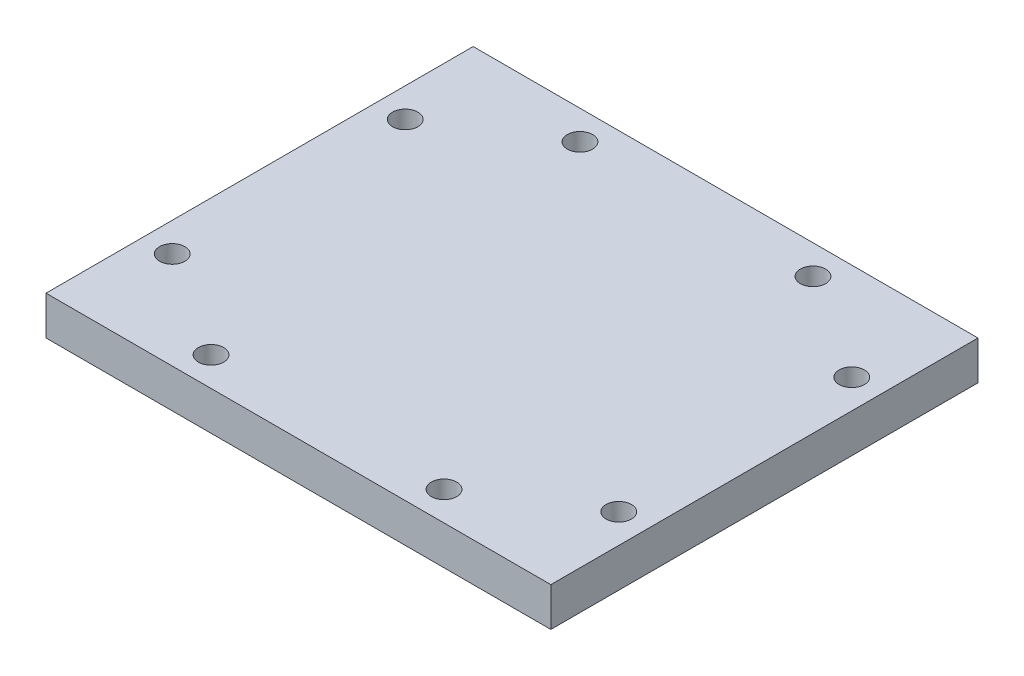
ISO-10303-21;
HEADER;
FILE_DESCRIPTION(('STEP AP214'),'2;1');
FILE_NAME('part.step','',(''),(''),'','','');
FILE_SCHEMA(('AUTOMOTIVE_DESIGN { 1 0 10303 214 1 1 1 1 }'));
ENDSEC;
DATA;
#1=APPLICATION_CONTEXT('core data for automotive mechanical design processes');
#2=APPLICATION_PROTOCOL_DEFINITION('international standard','automotive_design',2000,#1);
#3=PRODUCT_CONTEXT('',#1,'mechanical');
#4=PRODUCT('Part','Part','',(#3));
#5=PRODUCT_RELATED_PRODUCT_CATEGORY('part','',(#4));
#6=PRODUCT_DEFINITION_FORMATION('','',#4);
#7=PRODUCT_DEFINITION_CONTEXT('part definition',#1,'design');
#8=PRODUCT_DEFINITION('design','',#6,#7);
#9=PRODUCT_DEFINITION_SHAPE('','',#8);
#10=(LENGTH_UNIT() NAMED_UNIT(*) SI_UNIT(.MILLI.,.METRE.));
#11=(NAMED_UNIT(*) PLANE_ANGLE_UNIT() SI_UNIT($,.RADIAN.));
#12=(NAMED_UNIT(*) SI_UNIT($,.STERADIAN.) SOLID_ANGLE_UNIT());
#13=UNCERTAINTY_MEASURE_WITH_UNIT(LENGTH_MEASURE(1.E-05),#10,'distance_accuracy_value','');
#14=(GEOMETRIC_REPRESENTATION_CONTEXT(3) GLOBAL_UNCERTAINTY_ASSIGNED_CONTEXT((#13)) GLOBAL_UNIT_ASSIGNED_CONTEXT((#10,
#11,#12)) REPRESENTATION_CONTEXT('',''));
#15=CARTESIAN_POINT('',(0.,0.,0.));
#16=DIRECTION('',(0.,0.,1.));
#17=DIRECTION('',(1.,0.,0.));
#18=AXIS2_PLACEMENT_3D('',#15,#16,#17);
#19=CARTESIAN_POINT('',(0.,0.,0.));
#20=DIRECTION('',(0.,1.,0.));
#21=DIRECTION('',(0.,0.,1.));
#22=AXIS2_PLACEMENT_3D('',#19,#20,#21);
#23=PLANE('',#22);
#24=DIRECTION('',(0.,0.,1.));
#25=VECTOR('',#24,1.);
#26=CARTESIAN_POINT('',(-32.5,0.,27.5));
#27=LINE('',#26,#25);
#28=CARTESIAN_POINT('',(-32.5,0.,-27.5));
#29=VERTEX_POINT('',#28);
#30=CARTESIAN_POINT('',(-32.5,0.,27.5));
#31=VERTEX_POINT('',#30);
#32=EDGE_CURVE('E97',#29,#31,#27,.T.);
#33=ORIENTED_EDGE('',*,*,#32,.F.);
#34=DIRECTION('',(-1.,0.,0.));
#35=VECTOR('',#34,1.);
#36=CARTESIAN_POINT('',(32.5,0.,-27.5));
#37=LINE('',#36,#35);
#38=CARTESIAN_POINT('',(32.5,0.,-27.5));
#39=VERTEX_POINT('',#38);
#40=EDGE_CURVE('E73',#39,#29,#37,.T.);
#41=ORIENTED_EDGE('',*,*,#40,.F.);
#42=DIRECTION('',(0.,0.,-1.));
#43=VECTOR('',#42,1.);
#44=CARTESIAN_POINT('',(32.5,0.,27.5));
#45=LINE('',#44,#43);
#46=CARTESIAN_POINT('',(32.5,0.,27.5));
#47=VERTEX_POINT('',#46);
#48=EDGE_CURVE('E67',#47,#39,#45,.T.);
#49=ORIENTED_EDGE('',*,*,#48,.F.);
#50=DIRECTION('',(1.,0.,0.));
#51=VECTOR('',#50,1.);
#52=CARTESIAN_POINT('',(32.5,0.,27.5));
#53=LINE('',#52,#51);
#54=EDGE_CURVE('E89',#31,#47,#53,.T.);
#55=ORIENTED_EDGE('',*,*,#54,.F.);
#56=EDGE_LOOP('',(#33,#41,#49,#55));
#57=FACE_BOUND('',#56,.T.);
#58=CARTESIAN_POINT('',(28.75,0.,15.));
#59=DIRECTION('',(0.,-1.,0.));
#60=DIRECTION('',(0.,0.,-1.));
#61=AXIS2_PLACEMENT_3D('',#58,#59,#60);
#62=CIRCLE('',#61,1.63195);
#63=CARTESIAN_POINT('',(28.75,0.,13.36805));
#64=VERTEX_POINT('',#63);
#65=EDGE_CURVE('E113',#64,#64,#62,.T.);
#66=ORIENTED_EDGE('',*,*,#65,.F.);
#67=EDGE_LOOP('',(#66));
#68=FACE_BOUND('',#67,.T.);
#69=CARTESIAN_POINT('',(15.,0.,23.75));
#70=DIRECTION('',(0.,-1.,0.));
#71=DIRECTION('',(0.,0.,-1.));
#72=AXIS2_PLACEMENT_3D('',#69,#70,#71);
#73=CIRCLE('',#72,1.63195);
#74=CARTESIAN_POINT('',(15.,0.,22.11805));
#75=VERTEX_POINT('',#74);
#76=EDGE_CURVE('E119',#75,#75,#73,.T.);
#77=ORIENTED_EDGE('',*,*,#76,.F.);
#78=EDGE_LOOP('',(#77));
#79=FACE_BOUND('',#78,.T.);
#80=CARTESIAN_POINT('',(-15.,0.,23.75));
#81=DIRECTION('',(0.,-1.,0.));
#82=DIRECTION('',(0.,0.,-1.));
#83=AXIS2_PLACEMENT_3D('',#80,#81,#82);
#84=CIRCLE('',#83,1.63195);
#85=CARTESIAN_POINT('',(-15.,0.,22.11805));
#86=VERTEX_POINT('',#85);
#87=EDGE_CURVE('E125',#86,#86,#84,.T.);
#88=ORIENTED_EDGE('',*,*,#87,.F.);
#89=EDGE_LOOP('',(#88));
#90=FACE_BOUND('',#89,.T.);
#91=CARTESIAN_POINT('',(-28.75,0.,15.));
#92=DIRECTION('',(0.,-1.,0.));
#93=DIRECTION('',(0.,0.,-1.));
#94=AXIS2_PLACEMENT_3D('',#91,#92,#93);
#95=CIRCLE('',#94,1.63195);
#96=CARTESIAN_POINT('',(-28.75,0.,13.36805));
#97=VERTEX_POINT('',#96);
#98=EDGE_CURVE('E131',#97,#97,#95,.T.);
#99=ORIENTED_EDGE('',*,*,#98,.F.);
#100=EDGE_LOOP('',(#99));
#101=FACE_BOUND('',#100,.T.);
#102=CARTESIAN_POINT('',(-28.75,0.,-15.));
#103=DIRECTION('',(0.,-1.,0.));
#104=DIRECTION('',(0.,0.,-1.));
#105=AXIS2_PLACEMENT_3D('',#102,#103,#104);
#106=CIRCLE('',#105,1.63195);
#107=CARTESIAN_POINT('',(-28.75,0.,-16.63195));
#108=VERTEX_POINT('',#107);
#109=EDGE_CURVE('E137',#108,#108,#106,.T.);
#110=ORIENTED_EDGE('',*,*,#109,.F.);
#111=EDGE_LOOP('',(#110));
#112=FACE_BOUND('',#111,.T.);
#113=CARTESIAN_POINT('',(-15.,0.,-23.75));
#114=DIRECTION('',(0.,-1.,0.));
#115=DIRECTION('',(0.,0.,-1.));
#116=AXIS2_PLACEMENT_3D('',#113,#114,#115);
#117=CIRCLE('',#116,1.63195);
#118=CARTESIAN_POINT('',(-15.,0.,-25.38195));
#119=VERTEX_POINT('',#118);
#120=EDGE_CURVE('E143',#119,#119,#117,.T.);
#121=ORIENTED_EDGE('',*,*,#120,.F.);
#122=EDGE_LOOP('',(#121));
#123=FACE_BOUND('',#122,.T.);
#124=CARTESIAN_POINT('',(15.,0.,-23.75));
#125=DIRECTION('',(0.,-1.,0.));
#126=DIRECTION('',(0.,0.,-1.));
#127=AXIS2_PLACEMENT_3D('',#124,#125,#126);
#128=CIRCLE('',#127,1.63195);
#129=CARTESIAN_POINT('',(15.,0.,-25.38195));
#130=VERTEX_POINT('',#129);
#131=EDGE_CURVE('E149',#130,#130,#128,.T.);
#132=ORIENTED_EDGE('',*,*,#131,.F.);
#133=EDGE_LOOP('',(#132));
#134=FACE_BOUND('',#133,.T.);
#135=CARTESIAN_POINT('',(28.75,0.,-15.));
#136=DIRECTION('',(0.,-1.,0.));
#137=DIRECTION('',(0.,0.,-1.));
#138=AXIS2_PLACEMENT_3D('',#135,#136,#137);
#139=CIRCLE('',#138,1.63195);
#140=CARTESIAN_POINT('',(28.75,0.,-16.63195));
#141=VERTEX_POINT('',#140);
#142=EDGE_CURVE('E155',#141,#141,#139,.T.);
#143=ORIENTED_EDGE('',*,*,#142,.F.);
#144=EDGE_LOOP('',(#143));
#145=FACE_BOUND('',#144,.T.);
#146=ADVANCED_FACE('F33',(#57,#68,#79,#90,#101,#112,#123,#134,#145),#23,.F.);
#147=CARTESIAN_POINT('',(-32.5,5.,27.5));
#148=DIRECTION('',(1.,0.,0.));
#149=DIRECTION('',(0.,0.,-1.));
#150=AXIS2_PLACEMENT_3D('',#147,#148,#149);
#151=PLANE('',#150);
#152=ORIENTED_EDGE('',*,*,#32,.T.);
#153=DIRECTION('',(0.,-1.,0.));
#154=VECTOR('',#153,1.);
#155=CARTESIAN_POINT('',(-32.5,5.,27.5));
#156=LINE('',#155,#154);
#157=CARTESIAN_POINT('',(-32.5,5.,27.5));
#158=VERTEX_POINT('',#157);
#159=EDGE_CURVE('E11',#158,#31,#156,.T.);
#160=ORIENTED_EDGE('',*,*,#159,.F.);
#161=DIRECTION('',(0.,0.,1.));
#162=VECTOR('',#161,1.);
#163=CARTESIAN_POINT('',(-32.5,5.,27.5));
#164=LINE('',#163,#162);
#165=CARTESIAN_POINT('',(-32.5,5.,-27.5));
#166=VERTEX_POINT('',#165);
#167=EDGE_CURVE('E85',#166,#158,#164,.T.);
#168=ORIENTED_EDGE('',*,*,#167,.F.);
#169=DIRECTION('',(0.,-1.,0.));
#170=VECTOR('',#169,1.);
#171=CARTESIAN_POINT('',(-32.5,5.,-27.5));
#172=LINE('',#171,#170);
#173=EDGE_CURVE('E93',#166,#29,#172,.T.);
#174=ORIENTED_EDGE('',*,*,#173,.T.);
#175=EDGE_LOOP('',(#152,#160,#168,#174));
#176=FACE_BOUND('',#175,.T.);
#177=ADVANCED_FACE('F35',(#176),#151,.F.);
#178=CARTESIAN_POINT('',(32.5,5.,27.5));
#179=DIRECTION('',(0.,0.,-1.));
#180=DIRECTION('',(-1.,0.,0.));
#181=AXIS2_PLACEMENT_3D('',#178,#179,#180);
#182=PLANE('',#181);
#183=ORIENTED_EDGE('',*,*,#54,.T.);
#184=DIRECTION('',(0.,-1.,0.));
#185=VECTOR('',#184,1.);
#186=CARTESIAN_POINT('',(32.5,5.,27.5));
#187=LINE('',#186,#185);
#188=CARTESIAN_POINT('',(32.5,5.,27.5));
#189=VERTEX_POINT('',#188);
#190=EDGE_CURVE('E42',#189,#47,#187,.T.);
#191=ORIENTED_EDGE('',*,*,#190,.F.);
#192=DIRECTION('',(1.,0.,0.));
#193=VECTOR('',#192,1.);
#194=CARTESIAN_POINT('',(32.5,5.,27.5));
#195=LINE('',#194,#193);
#196=EDGE_CURVE('E80',#158,#189,#195,.T.);
#197=ORIENTED_EDGE('',*,*,#196,.F.);
#198=ORIENTED_EDGE('',*,*,#159,.T.);
#199=EDGE_LOOP('',(#183,#191,#197,#198));
#200=FACE_BOUND('',#199,.T.);
#201=ADVANCED_FACE('F88',(#200),#182,.F.);
#202=CARTESIAN_POINT('',(32.5,5.,27.5));
#203=DIRECTION('',(-1.,0.,0.));
#204=DIRECTION('',(0.,0.,1.));
#205=AXIS2_PLACEMENT_3D('',#202,#203,#204);
#206=PLANE('',#205);
#207=ORIENTED_EDGE('',*,*,#48,.T.);
#208=DIRECTION('',(0.,-1.,0.));
#209=VECTOR('',#208,1.);
#210=CARTESIAN_POINT('',(32.5,5.,-27.5));
#211=LINE('',#210,#209);
#212=CARTESIAN_POINT('',(32.5,5.,-27.5));
#213=VERTEX_POINT('',#212);
#214=EDGE_CURVE('E90',#213,#39,#211,.T.);
#215=ORIENTED_EDGE('',*,*,#214,.F.);
#216=DIRECTION('',(0.,0.,-1.));
#217=VECTOR('',#216,1.);
#218=CARTESIAN_POINT('',(32.5,5.,27.5));
#219=LINE('',#218,#217);
#220=EDGE_CURVE('E83',#189,#213,#219,.T.);
#221=ORIENTED_EDGE('',*,*,#220,.F.);
#222=ORIENTED_EDGE('',*,*,#190,.T.);
#223=EDGE_LOOP('',(#207,#215,#221,#222));
#224=FACE_BOUND('',#223,.T.);
#225=ADVANCED_FACE('F91',(#224),#206,.F.);
#226=CARTESIAN_POINT('',(32.5,5.,-27.5));
#227=DIRECTION('',(0.,0.,1.));
#228=DIRECTION('',(1.,0.,0.));
#229=AXIS2_PLACEMENT_3D('',#226,#227,#228);
#230=PLANE('',#229);
#231=ORIENTED_EDGE('',*,*,#40,.T.);
#232=ORIENTED_EDGE('',*,*,#173,.F.);
#233=DIRECTION('',(-1.,0.,0.));
#234=VECTOR('',#233,1.);
#235=CARTESIAN_POINT('',(32.5,5.,-27.5));
#236=LINE('',#235,#234);
#237=EDGE_CURVE('E50',#213,#166,#236,.T.);
#238=ORIENTED_EDGE('',*,*,#237,.F.);
#239=ORIENTED_EDGE('',*,*,#214,.T.);
#240=EDGE_LOOP('',(#231,#232,#238,#239));
#241=FACE_BOUND('',#240,.T.);
#242=ADVANCED_FACE('F105',(#241),#230,.F.);
#243=CARTESIAN_POINT('',(0.,5.,0.));
#244=DIRECTION('',(0.,1.,0.));
#245=DIRECTION('',(0.,0.,1.));
#246=AXIS2_PLACEMENT_3D('',#243,#244,#245);
#247=PLANE('',#246);
#248=CARTESIAN_POINT('',(28.75,5.,-15.));
#249=DIRECTION('',(0.,1.,0.));
#250=DIRECTION('',(0.,0.,1.));
#251=AXIS2_PLACEMENT_3D('',#248,#249,#250);
#252=CIRCLE('',#251,1.63195);
#253=CARTESIAN_POINT('',(28.75,5.,-13.36805));
#254=VERTEX_POINT('',#253);
#255=EDGE_CURVE('E152',#254,#254,#252,.T.);
#256=ORIENTED_EDGE('',*,*,#255,.F.);
#257=EDGE_LOOP('',(#256));
#258=FACE_BOUND('',#257,.T.);
#259=CARTESIAN_POINT('',(15.,5.,-23.75));
#260=DIRECTION('',(0.,1.,0.));
#261=DIRECTION('',(0.,0.,1.));
#262=AXIS2_PLACEMENT_3D('',#259,#260,#261);
#263=CIRCLE('',#262,1.63195);
#264=CARTESIAN_POINT('',(15.,5.,-22.11805));
#265=VERTEX_POINT('',#264);
#266=EDGE_CURVE('E146',#265,#265,#263,.T.);
#267=ORIENTED_EDGE('',*,*,#266,.F.);
#268=EDGE_LOOP('',(#267));
#269=FACE_BOUND('',#268,.T.);
#270=CARTESIAN_POINT('',(-15.,5.,-23.75));
#271=DIRECTION('',(0.,1.,0.));
#272=DIRECTION('',(0.,0.,1.));
#273=AXIS2_PLACEMENT_3D('',#270,#271,#272);
#274=CIRCLE('',#273,1.63195);
#275=CARTESIAN_POINT('',(-15.,5.,-22.11805));
#276=VERTEX_POINT('',#275);
#277=EDGE_CURVE('E140',#276,#276,#274,.T.);
#278=ORIENTED_EDGE('',*,*,#277,.F.);
#279=EDGE_LOOP('',(#278));
#280=FACE_BOUND('',#279,.T.);
#281=CARTESIAN_POINT('',(-28.75,5.,-15.));
#282=DIRECTION('',(0.,1.,0.));
#283=DIRECTION('',(0.,0.,1.));
#284=AXIS2_PLACEMENT_3D('',#281,#282,#283);
#285=CIRCLE('',#284,1.63195);
#286=CARTESIAN_POINT('',(-28.75,5.,-13.36805));
#287=VERTEX_POINT('',#286);
#288=EDGE_CURVE('E134',#287,#287,#285,.T.);
#289=ORIENTED_EDGE('',*,*,#288,.F.);
#290=EDGE_LOOP('',(#289));
#291=FACE_BOUND('',#290,.T.);
#292=CARTESIAN_POINT('',(-28.75,5.,15.));
#293=DIRECTION('',(0.,1.,0.));
#294=DIRECTION('',(0.,0.,1.));
#295=AXIS2_PLACEMENT_3D('',#292,#293,#294);
#296=CIRCLE('',#295,1.63195);
#297=CARTESIAN_POINT('',(-28.75,5.,16.63195));
#298=VERTEX_POINT('',#297);
#299=EDGE_CURVE('E128',#298,#298,#296,.T.);
#300=ORIENTED_EDGE('',*,*,#299,.F.);
#301=EDGE_LOOP('',(#300));
#302=FACE_BOUND('',#301,.T.);
#303=CARTESIAN_POINT('',(-15.,5.,23.75));
#304=DIRECTION('',(0.,1.,0.));
#305=DIRECTION('',(0.,0.,1.));
#306=AXIS2_PLACEMENT_3D('',#303,#304,#305);
#307=CIRCLE('',#306,1.63195);
#308=CARTESIAN_POINT('',(-15.,5.,25.38195));
#309=VERTEX_POINT('',#308);
#310=EDGE_CURVE('E122',#309,#309,#307,.T.);
#311=ORIENTED_EDGE('',*,*,#310,.F.);
#312=EDGE_LOOP('',(#311));
#313=FACE_BOUND('',#312,.T.);
#314=CARTESIAN_POINT('',(15.,5.,23.75));
#315=DIRECTION('',(0.,1.,0.));
#316=DIRECTION('',(0.,0.,1.));
#317=AXIS2_PLACEMENT_3D('',#314,#315,#316);
#318=CIRCLE('',#317,1.63195);
#319=CARTESIAN_POINT('',(15.,5.,25.38195));
#320=VERTEX_POINT('',#319);
#321=EDGE_CURVE('E116',#320,#320,#318,.T.);
#322=ORIENTED_EDGE('',*,*,#321,.F.);
#323=EDGE_LOOP('',(#322));
#324=FACE_BOUND('',#323,.T.);
#325=CARTESIAN_POINT('',(28.75,5.,15.));
#326=DIRECTION('',(0.,1.,0.));
#327=DIRECTION('',(0.,0.,1.));
#328=AXIS2_PLACEMENT_3D('',#325,#326,#327);
#329=CIRCLE('',#328,1.63195);
#330=CARTESIAN_POINT('',(28.75,5.,16.63195));
#331=VERTEX_POINT('',#330);
#332=EDGE_CURVE('E100',#331,#331,#329,.T.);
#333=ORIENTED_EDGE('',*,*,#332,.F.);
#334=EDGE_LOOP('',(#333));
#335=FACE_BOUND('',#334,.T.);
#336=ORIENTED_EDGE('',*,*,#167,.T.);
#337=ORIENTED_EDGE('',*,*,#196,.T.);
#338=ORIENTED_EDGE('',*,*,#220,.T.);
#339=ORIENTED_EDGE('',*,*,#237,.T.);
#340=EDGE_LOOP('',(#336,#337,#338,#339));
#341=FACE_BOUND('',#340,.T.);
#342=ADVANCED_FACE('F81',(#258,#269,#280,#291,#302,#313,#324,#335,#341),#247,.T.);
#343=CARTESIAN_POINT('',(28.75,0.,15.));
#344=DIRECTION('',(0.,-1.,0.));
#345=DIRECTION('',(0.,0.,-1.));
#346=AXIS2_PLACEMENT_3D('',#343,#344,#345);
#347=CYLINDRICAL_SURFACE('',#346,1.63195);
#348=ORIENTED_EDGE('',*,*,#65,.T.);
#349=EDGE_LOOP('',(#348));
#350=FACE_BOUND('',#349,.T.);
#351=ORIENTED_EDGE('',*,*,#332,.T.);
#352=EDGE_LOOP('',(#351));
#353=FACE_BOUND('',#352,.T.);
#354=ADVANCED_FACE('F192',(#350,#353),#347,.F.);
#355=CARTESIAN_POINT('',(15.,0.,23.75));
#356=DIRECTION('',(0.,-1.,0.));
#357=DIRECTION('',(0.,0.,-1.));
#358=AXIS2_PLACEMENT_3D('',#355,#356,#357);
#359=CYLINDRICAL_SURFACE('',#358,1.63195);
#360=ORIENTED_EDGE('',*,*,#76,.T.);
#361=EDGE_LOOP('',(#360));
#362=FACE_BOUND('',#361,.T.);
#363=ORIENTED_EDGE('',*,*,#321,.T.);
#364=EDGE_LOOP('',(#363));
#365=FACE_BOUND('',#364,.T.);
#366=ADVANCED_FACE('F199',(#362,#365),#359,.F.);
#367=CARTESIAN_POINT('',(-15.,0.,23.75));
#368=DIRECTION('',(0.,-1.,0.));
#369=DIRECTION('',(0.,0.,-1.));
#370=AXIS2_PLACEMENT_3D('',#367,#368,#369);
#371=CYLINDRICAL_SURFACE('',#370,1.63195);
#372=ORIENTED_EDGE('',*,*,#87,.T.);
#373=EDGE_LOOP('',(#372));
#374=FACE_BOUND('',#373,.T.);
#375=ORIENTED_EDGE('',*,*,#310,.T.);
#376=EDGE_LOOP('',(#375));
#377=FACE_BOUND('',#376,.T.);
#378=ADVANCED_FACE('F206',(#374,#377),#371,.F.);
#379=CARTESIAN_POINT('',(-28.75,0.,15.));
#380=DIRECTION('',(0.,-1.,0.));
#381=DIRECTION('',(0.,0.,-1.));
#382=AXIS2_PLACEMENT_3D('',#379,#380,#381);
#383=CYLINDRICAL_SURFACE('',#382,1.63195);
#384=ORIENTED_EDGE('',*,*,#98,.T.);
#385=EDGE_LOOP('',(#384));
#386=FACE_BOUND('',#385,.T.);
#387=ORIENTED_EDGE('',*,*,#299,.T.);
#388=EDGE_LOOP('',(#387));
#389=FACE_BOUND('',#388,.T.);
#390=ADVANCED_FACE('F214',(#386,#389),#383,.F.);
#391=CARTESIAN_POINT('',(-28.75,0.,-15.));
#392=DIRECTION('',(0.,-1.,0.));
#393=DIRECTION('',(0.,0.,-1.));
#394=AXIS2_PLACEMENT_3D('',#391,#392,#393);
#395=CYLINDRICAL_SURFACE('',#394,1.63195);
#396=ORIENTED_EDGE('',*,*,#109,.T.);
#397=EDGE_LOOP('',(#396));
#398=FACE_BOUND('',#397,.T.);
#399=ORIENTED_EDGE('',*,*,#288,.T.);
#400=EDGE_LOOP('',(#399));
#401=FACE_BOUND('',#400,.T.);
#402=ADVANCED_FACE('F222',(#398,#401),#395,.F.);
#403=CARTESIAN_POINT('',(-15.,0.,-23.75));
#404=DIRECTION('',(0.,-1.,0.));
#405=DIRECTION('',(0.,0.,-1.));
#406=AXIS2_PLACEMENT_3D('',#403,#404,#405);
#407=CYLINDRICAL_SURFACE('',#406,1.63195);
#408=ORIENTED_EDGE('',*,*,#120,.T.);
#409=EDGE_LOOP('',(#408));
#410=FACE_BOUND('',#409,.T.);
#411=ORIENTED_EDGE('',*,*,#277,.T.);
#412=EDGE_LOOP('',(#411));
#413=FACE_BOUND('',#412,.T.);
#414=ADVANCED_FACE('F230',(#410,#413),#407,.F.);
#415=CARTESIAN_POINT('',(15.,0.,-23.75));
#416=DIRECTION('',(0.,-1.,0.));
#417=DIRECTION('',(0.,0.,-1.));
#418=AXIS2_PLACEMENT_3D('',#415,#416,#417);
#419=CYLINDRICAL_SURFACE('',#418,1.63195);
#420=ORIENTED_EDGE('',*,*,#131,.T.);
#421=EDGE_LOOP('',(#420));
#422=FACE_BOUND('',#421,.T.);
#423=ORIENTED_EDGE('',*,*,#266,.T.);
#424=EDGE_LOOP('',(#423));
#425=FACE_BOUND('',#424,.T.);
#426=ADVANCED_FACE('F238',(#422,#425),#419,.F.);
#427=CARTESIAN_POINT('',(28.75,0.,-15.));
#428=DIRECTION('',(0.,-1.,0.));
#429=DIRECTION('',(0.,0.,-1.));
#430=AXIS2_PLACEMENT_3D('',#427,#428,#429);
#431=CYLINDRICAL_SURFACE('',#430,1.63195);
#432=ORIENTED_EDGE('',*,*,#142,.T.);
#433=EDGE_LOOP('',(#432));
#434=FACE_BOUND('',#433,.T.);
#435=ORIENTED_EDGE('',*,*,#255,.T.);
#436=EDGE_LOOP('',(#435));
#437=FACE_BOUND('',#436,.T.);
#438=ADVANCED_FACE('F159',(#434,#437),#431,.F.);
#439=CLOSED_SHELL('',(#146,#177,#201,#225,#242,#342,#354,#366,#378,#390,#402,#414,#426,#438));
#440=MANIFOLD_SOLID_BREP('B2',#439);
#441=ADVANCED_BREP_SHAPE_REPRESENTATION('',(#18,#440),#14);
#442=SHAPE_DEFINITION_REPRESENTATION(#9,#441);
ENDSEC;
END-ISO-10303-21;
